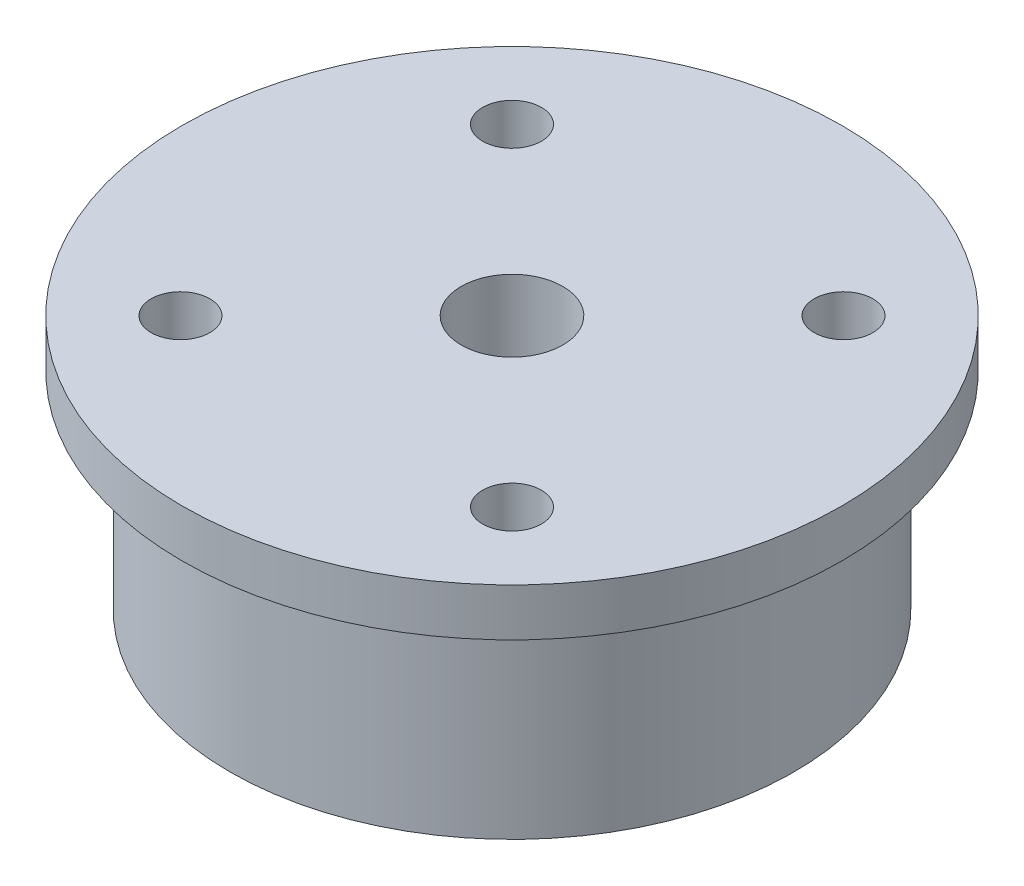
ISO-10303-21;
HEADER;
FILE_DESCRIPTION(('STEP AP214'),'2;1');
FILE_NAME('part.step','',(''),(''),'','','');
FILE_SCHEMA(('AUTOMOTIVE_DESIGN { 1 0 10303 214 1 1 1 1 }'));
ENDSEC;
DATA;
#1=APPLICATION_CONTEXT('core data for automotive mechanical design processes');
#2=APPLICATION_PROTOCOL_DEFINITION('international standard','automotive_design',2000,#1);
#3=PRODUCT_CONTEXT('',#1,'mechanical');
#4=PRODUCT('Part','Part','',(#3));
#5=PRODUCT_RELATED_PRODUCT_CATEGORY('part','',(#4));
#6=PRODUCT_DEFINITION_FORMATION('','',#4);
#7=PRODUCT_DEFINITION_CONTEXT('part definition',#1,'design');
#8=PRODUCT_DEFINITION('design','',#6,#7);
#9=PRODUCT_DEFINITION_SHAPE('','',#8);
#10=(LENGTH_UNIT() NAMED_UNIT(*) SI_UNIT(.MILLI.,.METRE.));
#11=(NAMED_UNIT(*) PLANE_ANGLE_UNIT() SI_UNIT($,.RADIAN.));
#12=(NAMED_UNIT(*) SI_UNIT($,.STERADIAN.) SOLID_ANGLE_UNIT());
#13=UNCERTAINTY_MEASURE_WITH_UNIT(LENGTH_MEASURE(1.E-05),#10,'distance_accuracy_value','');
#14=(GEOMETRIC_REPRESENTATION_CONTEXT(3) GLOBAL_UNCERTAINTY_ASSIGNED_CONTEXT((#13)) GLOBAL_UNIT_ASSIGNED_CONTEXT((#10,
#11,#12)) REPRESENTATION_CONTEXT('',''));
#15=CARTESIAN_POINT('',(0.,0.,0.));
#16=DIRECTION('',(0.,0.,1.));
#17=DIRECTION('',(1.,0.,0.));
#18=AXIS2_PLACEMENT_3D('',#15,#16,#17);
#19=CARTESIAN_POINT('',(0.,6.5,0.));
#20=DIRECTION('',(0.,-1.,0.));
#21=DIRECTION('',(0.,0.,-1.));
#22=AXIS2_PLACEMENT_3D('',#19,#20,#21);
#23=CYLINDRICAL_SURFACE('',#22,1.6);
#24=CARTESIAN_POINT('',(0.,0.,0.));
#25=DIRECTION('',(0.,1.,0.));
#26=DIRECTION('',(0.,0.,1.));
#27=AXIS2_PLACEMENT_3D('',#24,#25,#26);
#28=CIRCLE('',#27,1.6);
#29=CARTESIAN_POINT('',(0.,0.,-1.6));
#30=VERTEX_POINT('',#29);
#31=EDGE_CURVE('E79',#30,#30,#28,.T.);
#32=CARTESIAN_POINT('',(0.,8.,0.));
#33=DIRECTION('',(0.,1.,0.));
#34=DIRECTION('',(0.,0.,1.));
#35=AXIS2_PLACEMENT_3D('',#32,#33,#34);
#36=CIRCLE('',#35,1.6);
#37=CARTESIAN_POINT('',(0.,8.,-1.6));
#38=VERTEX_POINT('',#37);
#39=EDGE_CURVE('E97',#38,#38,#36,.T.);
#40=CARTESIAN_POINT('',(0.,0.,-1.6));
#41=CARTESIAN_POINT('',(0.,0.0833333333333333,-1.6));
#42=CARTESIAN_POINT('',(0.,0.166666666666667,-1.6));
#43=CARTESIAN_POINT('',(0.,0.333333333333334,-1.6));
#44=CARTESIAN_POINT('',(0.,0.416666666666667,-1.6));
#45=CARTESIAN_POINT('',(0.,0.583333333333334,-1.6));
#46=CARTESIAN_POINT('',(0.,0.666666666666667,-1.6));
#47=CARTESIAN_POINT('',(0.,0.833333333333333,-1.6));
#48=CARTESIAN_POINT('',(0.,0.916666666666667,-1.6));
#49=CARTESIAN_POINT('',(0.,1.08333333333333,-1.6));
#50=CARTESIAN_POINT('',(0.,1.16666666666667,-1.6));
#51=CARTESIAN_POINT('',(0.,1.33333333333333,-1.6));
#52=CARTESIAN_POINT('',(0.,1.41666666666667,-1.6));
#53=CARTESIAN_POINT('',(0.,1.58333333333333,-1.6));
#54=CARTESIAN_POINT('',(0.,1.66666666666667,-1.6));
#55=CARTESIAN_POINT('',(0.,1.83333333333333,-1.6));
#56=CARTESIAN_POINT('',(0.,1.91666666666667,-1.6));
#57=CARTESIAN_POINT('',(0.,2.08333333333333,-1.6));
#58=CARTESIAN_POINT('',(0.,2.16666666666667,-1.6));
#59=CARTESIAN_POINT('',(0.,2.33333333333333,-1.6));
#60=CARTESIAN_POINT('',(0.,2.41666666666667,-1.6));
#61=CARTESIAN_POINT('',(0.,2.58333333333333,-1.6));
#62=CARTESIAN_POINT('',(0.,2.66666666666667,-1.6));
#63=CARTESIAN_POINT('',(0.,2.83333333333333,-1.6));
#64=CARTESIAN_POINT('',(0.,2.91666666666667,-1.6));
#65=CARTESIAN_POINT('',(0.,3.08333333333333,-1.6));
#66=CARTESIAN_POINT('',(0.,3.16666666666667,-1.6));
#67=CARTESIAN_POINT('',(0.,3.33333333333333,-1.6));
#68=CARTESIAN_POINT('',(0.,3.41666666666667,-1.6));
#69=CARTESIAN_POINT('',(0.,3.58333333333333,-1.6));
#70=CARTESIAN_POINT('',(0.,3.66666666666667,-1.6));
#71=CARTESIAN_POINT('',(0.,3.83333333333333,-1.6));
#72=CARTESIAN_POINT('',(0.,3.91666666666667,-1.6));
#73=CARTESIAN_POINT('',(0.,4.08333333333333,-1.6));
#74=CARTESIAN_POINT('',(0.,4.16666666666667,-1.6));
#75=CARTESIAN_POINT('',(0.,4.33333333333333,-1.6));
#76=CARTESIAN_POINT('',(0.,4.41666666666667,-1.6));
#77=CARTESIAN_POINT('',(0.,4.58333333333333,-1.6));
#78=CARTESIAN_POINT('',(0.,4.66666666666667,-1.6));
#79=CARTESIAN_POINT('',(0.,4.83333333333333,-1.6));
#80=CARTESIAN_POINT('',(0.,4.91666666666667,-1.6));
#81=CARTESIAN_POINT('',(0.,5.08333333333333,-1.6));
#82=CARTESIAN_POINT('',(0.,5.16666666666667,-1.6));
#83=CARTESIAN_POINT('',(0.,5.33333333333333,-1.6));
#84=CARTESIAN_POINT('',(0.,5.41666666666667,-1.6));
#85=CARTESIAN_POINT('',(0.,5.58333333333333,-1.6));
#86=CARTESIAN_POINT('',(0.,5.66666666666667,-1.6));
#87=CARTESIAN_POINT('',(0.,5.83333333333333,-1.6));
#88=CARTESIAN_POINT('',(0.,5.91666666666667,-1.6));
#89=CARTESIAN_POINT('',(0.,6.08333333333333,-1.6));
#90=CARTESIAN_POINT('',(0.,6.16666666666667,-1.6));
#91=CARTESIAN_POINT('',(0.,6.33333333333333,-1.6));
#92=CARTESIAN_POINT('',(0.,6.41666666666667,-1.6));
#93=CARTESIAN_POINT('',(0.,6.58333333333333,-1.6));
#94=CARTESIAN_POINT('',(0.,6.66666666666667,-1.6));
#95=CARTESIAN_POINT('',(0.,6.83333333333333,-1.6));
#96=CARTESIAN_POINT('',(0.,6.91666666666667,-1.6));
#97=CARTESIAN_POINT('',(0.,7.08333333333333,-1.6));
#98=CARTESIAN_POINT('',(0.,7.16666666666667,-1.6));
#99=CARTESIAN_POINT('',(0.,7.33333333333333,-1.6));
#100=CARTESIAN_POINT('',(0.,7.41666666666667,-1.6));
#101=CARTESIAN_POINT('',(0.,7.58333333333333,-1.6));
#102=CARTESIAN_POINT('',(0.,7.66666666666667,-1.6));
#103=CARTESIAN_POINT('',(0.,7.83333333333333,-1.6));
#104=CARTESIAN_POINT('',(0.,7.91666666666667,-1.6));
#105=CARTESIAN_POINT('',(0.,8.,-1.6));
#106=B_SPLINE_CURVE_WITH_KNOTS('',3,(#40,#41,#42,#43,#44,#45,#46,#47,#48,#49,#50,#51,#52,#53,
#54,#55,#56,#57,#58,#59,#60,#61,#62,#63,#64,#65,#66,#67,#68,#69,#70,#71,#72,#73,#74,#75,#76,#77,
#78,#79,#80,#81,#82,#83,#84,#85,#86,#87,#88,#89,#90,#91,#92,#93,#94,#95,#96,#97,#98,#99,#100,
#101,#102,#103,#104,#105),.UNSPECIFIED.,.F.,.F.,(4,2,2,2,2,2,2,2,2,2,2,2,2,2,2,2,2,2,2,2,2,2,2,
2,2,2,2,2,2,2,2,2,4),(0.,0.25,0.5,0.75,1.,1.25,1.5,1.75,2.,2.25,2.5,2.75,3.,3.25,3.5,3.75,4.,
4.25,4.5,4.75,5.,5.25,5.5,5.75,6.,6.25,6.5,6.75,7.,7.25,7.5,7.75,8.),.UNSPECIFIED.);
#107=EDGE_CURVE('BSEAM55',#30,#38,#106,.T.);
#108=ORIENTED_EDGE('',*,*,#31,.F.);
#109=ORIENTED_EDGE('',*,*,#39,.T.);
#110=ORIENTED_EDGE('',*,*,#107,.T.);
#111=ORIENTED_EDGE('',*,*,#107,.F.);
#112=EDGE_LOOP('',(#108,#110,#109,#111));
#113=FACE_BOUND('',#112,.T.);
#114=ADVANCED_FACE('F55',(#113),#23,.F.);
#115=CARTESIAN_POINT('',(0.,6.5,0.));
#116=DIRECTION('',(0.,-1.,0.));
#117=DIRECTION('',(0.,0.,-1.));
#118=AXIS2_PLACEMENT_3D('',#115,#116,#117);
#119=CYLINDRICAL_SURFACE('',#118,8.88);
#120=CARTESIAN_POINT('',(0.,5.1,-8.88));
#121=CARTESIAN_POINT('',(-0.129585289133264,5.09999684998418,-8.87999801208095));
#122=CARTESIAN_POINT('',(-0.259204506457063,5.0892455305228,-8.87713549724354));
#123=CARTESIAN_POINT('',(-0.514711359988746,5.04659897144089,-8.86599427911455));
#124=CARTESIAN_POINT('',(-0.640597128899053,5.01469333170439,-8.85771291177428));
#125=CARTESIAN_POINT('',(-0.884911819698373,4.93084628380542,-8.83664840609071));
#126=CARTESIAN_POINT('',(-1.00335004998425,4.878930488789,-8.82387102449195));
#127=CARTESIAN_POINT('',(-1.22983818264274,4.75663118026291,-8.79516613197104));
#128=CARTESIAN_POINT('',(-1.33788743400293,4.68624651045341,-8.77923842382854));
#129=CARTESIAN_POINT('',(-1.54300100811903,4.52730821752643,-8.74554650459054));
#130=CARTESIAN_POINT('',(-1.63979394284996,4.43841092794475,-8.72775127827033));
#131=CARTESIAN_POINT('',(-1.81728597586606,4.24570565854619,-8.69252996065879));
#132=CARTESIAN_POINT('',(-1.89798303534429,4.14189579266774,-8.67510391637998));
#133=CARTESIAN_POINT('',(-2.04231001302697,3.92015327413902,-8.64227731863866));
#134=CARTESIAN_POINT('',(-2.10562879748089,3.80201178261496,-8.62691592695273));
#135=CARTESIAN_POINT('',(-2.21139821628251,3.55628791481431,-8.60041345934422));
#136=CARTESIAN_POINT('',(-2.25385263385972,3.42870725492472,-8.58927161839607));
#137=CARTESIAN_POINT('',(-2.31574775166628,3.17072954588639,-8.57278980730723));
#138=CARTESIAN_POINT('',(-2.33567999020068,3.04045852319523,-8.56732613568692));
#139=CARTESIAN_POINT('',(-2.35349721816228,2.77831586562723,-8.56244961024532));
#140=CARTESIAN_POINT('',(-2.35138625973293,2.64644452938359,-8.56303564432217));
#141=CARTESIAN_POINT('',(-2.32556749060522,2.38867246603751,-8.57008154002525));
#142=CARTESIAN_POINT('',(-2.30245331970669,2.26270716541838,-8.57637993687077));
#143=CARTESIAN_POINT('',(-2.23623456766338,2.01650937234912,-8.59388250417231));
#144=CARTESIAN_POINT('',(-2.19312841041219,1.89627733271587,-8.60508706141097));
#145=CARTESIAN_POINT('',(-2.087662826246,1.66340608032448,-8.63128223136183));
#146=CARTESIAN_POINT('',(-2.0250943723219,1.55086631347566,-8.6463136099601));
#147=CARTESIAN_POINT('',(-1.88262615275715,1.33767426687774,-8.67844671441819));
#148=CARTESIAN_POINT('',(-1.80272302226022,1.23702430093992,-8.69554884194853));
#149=CARTESIAN_POINT('',(-1.62481333242203,1.0470759466642,-8.73056953206238));
#150=CARTESIAN_POINT('',(-1.52630795703414,0.958245694470325,-8.74849667937925));
#151=CARTESIAN_POINT('',(-1.31558009861242,0.798270329447083,-8.78265480249399));
#152=CARTESIAN_POINT('',(-1.20335709130346,0.727125892868593,-8.79888571341927));
#153=CARTESIAN_POINT('',(-0.967661735310538,0.604339889327529,-8.82791993444626));
#154=CARTESIAN_POINT('',(-0.844143880864923,0.552781953993764,-8.84070847993485));
#155=CARTESIAN_POINT('',(-0.589778271558278,0.471297217316951,-8.86131025450366));
#156=CARTESIAN_POINT('',(-0.458932099885075,0.441365763127861,-8.86912455372885));
#157=CARTESIAN_POINT('',(-0.197620172874529,0.404716156971727,-8.87873597197536));
#158=CARTESIAN_POINT('',(-0.0672496350220839,0.397361408014559,-8.88069805981672));
#159=CARTESIAN_POINT('',(0.192861735434264,0.404317444923737,-8.87885772294866));
#160=CARTESIAN_POINT('',(0.322602630719435,0.418626027888854,-8.87505588436142));
#161=CARTESIAN_POINT('',(0.575507223925612,0.467980069404079,-8.86222132477574));
#162=CARTESIAN_POINT('',(0.698744975887391,0.502671426070991,-8.85327798091623));
#163=CARTESIAN_POINT('',(0.937640440787909,0.591395895235778,-8.83117402567267));
#164=CARTESIAN_POINT('',(1.05329733718154,0.645431087249516,-8.81801296088789));
#165=CARTESIAN_POINT('',(1.27622899839518,0.77249674827515,-8.78854582236923));
#166=CARTESIAN_POINT('',(1.38329806007462,0.845874812506769,-8.77218377863204));
#167=CARTESIAN_POINT('',(1.58382693086847,1.00910539460631,-8.73820654532676));
#168=CARTESIAN_POINT('',(1.67728408771308,1.098961115449,-8.72059111252941));
#169=CARTESIAN_POINT('',(1.85061144919231,1.29556537626198,-8.68548712936175));
#170=CARTESIAN_POINT('',(1.93003280916631,1.40271339525644,-8.66801565548488));
#171=CARTESIAN_POINT('',(2.06977621906292,1.62918455296581,-8.6357159577957));
#172=CARTESIAN_POINT('',(2.13009907490246,1.74850717765679,-8.62088762246002));
#173=CARTESIAN_POINT('',(2.22947901569099,1.99533806093285,-8.59572292540364));
#174=CARTESIAN_POINT('',(2.2686598069129,2.12279371282514,-8.58536050620928));
#175=CARTESIAN_POINT('',(2.32494065000371,2.38280453385698,-8.57029263886158));
#176=CARTESIAN_POINT('',(2.34204624073471,2.51535841520672,-8.5655857717009));
#177=CARTESIAN_POINT('',(2.35337608831695,2.77721126080348,-8.56247919441447));
#178=CARTESIAN_POINT('',(2.34832123773893,2.90647714675708,-8.56388076428023));
#179=CARTESIAN_POINT('',(2.31714312273957,3.16224273259772,-8.57236860268427));
#180=CARTESIAN_POINT('',(2.29102038498937,3.28874250155307,-8.57945472911565));
#181=CARTESIAN_POINT('',(2.21886302525025,3.53449310420915,-8.59839589150808));
#182=CARTESIAN_POINT('',(2.17297897142437,3.65379112593871,-8.61021481976972));
#183=CARTESIAN_POINT('',(2.06271861187933,3.88308540068774,-8.63729126062263));
#184=CARTESIAN_POINT('',(1.99833944588416,3.99308021155381,-8.65254930499581));
#185=CARTESIAN_POINT('',(1.85072215282304,4.20409207453658,-8.68533777980724));
#186=CARTESIAN_POINT('',(1.76699104793136,4.3047560519055,-8.70292129676406));
#187=CARTESIAN_POINT('',(1.58398714605769,4.49083875709403,-8.73808054188653));
#188=CARTESIAN_POINT('',(1.48471058752775,4.57625378437753,-8.75565626713191));
#189=CARTESIAN_POINT('',(1.27092154046083,4.7311730378896,-8.78926026106073));
#190=CARTESIAN_POINT('',(1.15613319533889,4.80030602756172,-8.80524834769998));
#191=CARTESIAN_POINT('',(0.916145366917736,4.91818441187165,-8.83343815754617));
#192=CARTESIAN_POINT('',(0.790952726409114,4.96694308123272,-8.84564234478037));
#193=CARTESIAN_POINT('',(0.555161542007729,5.03621877973961,-8.86328267560475));
#194=CARTESIAN_POINT('',(0.44559320066805,5.06008167310706,-8.8695063191191));
#195=CARTESIAN_POINT('',(0.224024869252993,5.09197288815313,-8.87786564523955));
#196=CARTESIAN_POINT('',(0.112025112606921,5.10000272315537,-8.88000171853501));
#197=CARTESIAN_POINT('',(0.,5.1,-8.88));
#198=B_SPLINE_CURVE_WITH_KNOTS('',3,(#120,#121,#122,#123,#124,#125,#126,#127,#128,#129,#130,
#131,#132,#133,#134,#135,#136,#137,#138,#139,#140,#141,#142,#143,#144,#145,#146,#147,#148,#149,
#150,#151,#152,#153,#154,#155,#156,#157,#158,#159,#160,#161,#162,#163,#164,#165,#166,#167,#168,
#169,#170,#171,#172,#173,#174,#175,#176,#177,#178,#179,#180,#181,#182,#183,#184,#185,#186,#187,
#188,#189,#190,#191,#192,#193,#194,#195,#196,#197),.UNSPECIFIED.,.T.,.F.,(4,2,2,2,2,2,2,2,2,2,2,
2,2,2,2,2,2,2,2,2,2,2,2,2,2,2,2,2,2,2,2,2,2,2,2,2,2,2,4),(0.,0.388345079422037,
0.776881222965017,1.16492168018898,1.55298643765955,1.94902638559029,2.34511646667209,
2.74789348968465,3.1505974522173,3.54433170640418,3.93799358272355,4.32086366224912,
4.70376393120064,5.0909275122296,5.47816631342726,5.87783634471825,6.27752165580504,
6.67889488249067,7.08018172968843,7.47004440781371,7.85986744423962,8.24311051736039,
8.62639480255105,9.01710172924578,9.40788468334782,9.80950851062321,10.2111153879539,
10.6103461789214,11.0094767798816,11.3957214818909,11.7819565285594,12.1652993850264,
12.548701557553,12.9432277378033,13.3378495298622,13.7407470789338,14.1433817125166,
14.479134021233,14.8148542371895),.UNSPECIFIED.);
#199=CARTESIAN_POINT('',(0.,5.1,-8.88));
#200=VERTEX_POINT('',#199);
#201=EDGE_CURVE('E11',#200,#200,#198,.T.);
#202=ORIENTED_EDGE('',*,*,#201,.T.);
#203=EDGE_LOOP('',(#202));
#204=FACE_BOUND('',#203,.T.);
#205=CARTESIAN_POINT('',(0.,6.5,0.));
#206=DIRECTION('',(0.,1.,0.));
#207=DIRECTION('',(0.,0.,1.));
#208=AXIS2_PLACEMENT_3D('',#205,#206,#207);
#209=CIRCLE('',#208,8.88);
#210=CARTESIAN_POINT('',(0.,6.5,8.88));
#211=VERTEX_POINT('',#210);
#212=EDGE_CURVE('E66',#211,#211,#209,.T.);
#213=ORIENTED_EDGE('',*,*,#212,.F.);
#214=EDGE_LOOP('',(#213));
#215=FACE_BOUND('',#214,.T.);
#216=CARTESIAN_POINT('',(0.,0.,0.));
#217=DIRECTION('',(0.,1.,0.));
#218=DIRECTION('',(0.,0.,1.));
#219=AXIS2_PLACEMENT_3D('',#216,#217,#218);
#220=CIRCLE('',#219,8.88);
#221=CARTESIAN_POINT('',(0.,0.,8.88));
#222=VERTEX_POINT('',#221);
#223=EDGE_CURVE('E72',#222,#222,#220,.T.);
#224=ORIENTED_EDGE('',*,*,#223,.T.);
#225=EDGE_LOOP('',(#224));
#226=FACE_BOUND('',#225,.T.);
#227=ADVANCED_FACE('F162',(#204,#215,#226),#119,.T.);
#228=CARTESIAN_POINT('',(0.,0.,0.));
#229=DIRECTION('',(0.,1.,0.));
#230=DIRECTION('',(0.,0.,1.));
#231=AXIS2_PLACEMENT_3D('',#228,#229,#230);
#232=PLANE('',#231);
#233=ORIENTED_EDGE('',*,*,#31,.T.);
#234=EDGE_LOOP('',(#233));
#235=FACE_BOUND('',#234,.T.);
#236=ORIENTED_EDGE('',*,*,#223,.F.);
#237=EDGE_LOOP('',(#236));
#238=FACE_BOUND('',#237,.T.);
#239=ADVANCED_FACE('F154',(#235,#238),#232,.F.);
#240=CARTESIAN_POINT('',(0.,8.,0.));
#241=DIRECTION('',(0.,1.,0.));
#242=DIRECTION('',(0.,0.,1.));
#243=AXIS2_PLACEMENT_3D('',#240,#241,#242);
#244=PLANE('',#243);
#245=CARTESIAN_POINT('',(5.21844804515673,8.,-5.21844804515671));
#246=DIRECTION('',(0.,1.,0.));
#247=DIRECTION('',(0.,0.,1.));
#248=AXIS2_PLACEMENT_3D('',#245,#246,#247);
#249=CIRCLE('',#248,0.925000000000001);
#250=CARTESIAN_POINT('',(5.21844804515673,8.,-4.29344804515671));
#251=VERTEX_POINT('',#250);
#252=EDGE_CURVE('E127',#251,#251,#249,.T.);
#253=ORIENTED_EDGE('',*,*,#252,.F.);
#254=EDGE_LOOP('',(#253));
#255=FACE_BOUND('',#254,.T.);
#256=CARTESIAN_POINT('',(5.21844804515669,8.,5.21844804515675));
#257=DIRECTION('',(0.,1.,0.));
#258=DIRECTION('',(0.,0.,1.));
#259=AXIS2_PLACEMENT_3D('',#256,#257,#258);
#260=CIRCLE('',#259,0.925000000000001);
#261=CARTESIAN_POINT('',(5.21844804515669,8.,6.14344804515675));
#262=VERTEX_POINT('',#261);
#263=EDGE_CURVE('E135',#262,#262,#260,.T.);
#264=ORIENTED_EDGE('',*,*,#263,.F.);
#265=EDGE_LOOP('',(#264));
#266=FACE_BOUND('',#265,.T.);
#267=CARTESIAN_POINT('',(-5.21844804515676,8.,5.21844804515668));
#268=DIRECTION('',(0.,1.,0.));
#269=DIRECTION('',(0.,0.,1.));
#270=AXIS2_PLACEMENT_3D('',#267,#268,#269);
#271=CIRCLE('',#270,0.925);
#272=CARTESIAN_POINT('',(-5.21844804515676,8.,6.14344804515668));
#273=VERTEX_POINT('',#272);
#274=EDGE_CURVE('E119',#273,#273,#271,.T.);
#275=ORIENTED_EDGE('',*,*,#274,.F.);
#276=EDGE_LOOP('',(#275));
#277=FACE_BOUND('',#276,.T.);
#278=CARTESIAN_POINT('',(-5.21844804515673,8.,-5.21844804515671));
#279=DIRECTION('',(0.,1.,0.));
#280=DIRECTION('',(0.,0.,1.));
#281=AXIS2_PLACEMENT_3D('',#278,#279,#280);
#282=CIRCLE('',#281,0.925);
#283=CARTESIAN_POINT('',(-5.21844804515673,8.,-4.29344804515671));
#284=VERTEX_POINT('',#283);
#285=EDGE_CURVE('E115',#284,#284,#282,.T.);
#286=ORIENTED_EDGE('',*,*,#285,.F.);
#287=EDGE_LOOP('',(#286));
#288=FACE_BOUND('',#287,.T.);
#289=CARTESIAN_POINT('',(0.,8.,0.));
#290=DIRECTION('',(0.,1.,0.));
#291=DIRECTION('',(0.,0.,1.));
#292=AXIS2_PLACEMENT_3D('',#289,#290,#291);
#293=CIRCLE('',#292,10.38);
#294=CARTESIAN_POINT('',(0.,8.,10.38));
#295=VERTEX_POINT('',#294);
#296=EDGE_CURVE('E86',#295,#295,#293,.T.);
#297=ORIENTED_EDGE('',*,*,#296,.T.);
#298=EDGE_LOOP('',(#297));
#299=FACE_BOUND('',#298,.T.);
#300=ORIENTED_EDGE('',*,*,#39,.F.);
#301=EDGE_LOOP('',(#300));
#302=FACE_BOUND('',#301,.T.);
#303=ADVANCED_FACE('F150',(#255,#266,#277,#288,#299,#302),#244,.T.);
#304=CARTESIAN_POINT('',(0.,6.5,0.));
#305=DIRECTION('',(0.,1.,0.));
#306=DIRECTION('',(0.,0.,1.));
#307=AXIS2_PLACEMENT_3D('',#304,#305,#306);
#308=PLANE('',#307);
#309=ORIENTED_EDGE('',*,*,#212,.T.);
#310=EDGE_LOOP('',(#309));
#311=FACE_BOUND('',#310,.T.);
#312=CARTESIAN_POINT('',(0.,6.5,0.));
#313=DIRECTION('',(0.,1.,0.));
#314=DIRECTION('',(0.,0.,1.));
#315=AXIS2_PLACEMENT_3D('',#312,#313,#314);
#316=CIRCLE('',#315,10.38);
#317=CARTESIAN_POINT('',(0.,6.5,10.38));
#318=VERTEX_POINT('',#317);
#319=EDGE_CURVE('E82',#318,#318,#316,.T.);
#320=ORIENTED_EDGE('',*,*,#319,.F.);
#321=EDGE_LOOP('',(#320));
#322=FACE_BOUND('',#321,.T.);
#323=ADVANCED_FACE('F153',(#311,#322),#308,.F.);
#324=CARTESIAN_POINT('',(0.,8.,0.));
#325=DIRECTION('',(0.,-1.,0.));
#326=DIRECTION('',(0.,0.,-1.));
#327=AXIS2_PLACEMENT_3D('',#324,#325,#326);
#328=CYLINDRICAL_SURFACE('',#327,10.38);
#329=ORIENTED_EDGE('',*,*,#296,.F.);
#330=EDGE_LOOP('',(#329));
#331=FACE_BOUND('',#330,.T.);
#332=ORIENTED_EDGE('',*,*,#319,.T.);
#333=EDGE_LOOP('',(#332));
#334=FACE_BOUND('',#333,.T.);
#335=ADVANCED_FACE('F172',(#331,#334),#328,.T.);
#336=CARTESIAN_POINT('',(0.,2.75,-7.68));
#337=DIRECTION('',(0.,0.,-1.));
#338=DIRECTION('',(-1.,0.,0.));
#339=AXIS2_PLACEMENT_3D('',#336,#337,#338);
#340=CYLINDRICAL_SURFACE('',#339,2.35);
#341=CARTESIAN_POINT('',(0.,2.75,-7.68));
#342=DIRECTION('',(0.,0.,-1.));
#343=DIRECTION('',(-1.,0.,0.));
#344=AXIS2_PLACEMENT_3D('',#341,#342,#343);
#345=CIRCLE('',#344,2.35);
#346=CARTESIAN_POINT('',(-2.35,2.75,-7.68));
#347=VERTEX_POINT('',#346);
#348=EDGE_CURVE('E102',#347,#347,#345,.T.);
#349=ORIENTED_EDGE('',*,*,#348,.F.);
#350=EDGE_LOOP('',(#349));
#351=FACE_BOUND('',#350,.T.);
#352=ORIENTED_EDGE('',*,*,#201,.F.);
#353=EDGE_LOOP('',(#352));
#354=FACE_BOUND('',#353,.T.);
#355=ADVANCED_FACE('F175',(#351,#354),#340,.F.);
#356=CARTESIAN_POINT('',(0.,2.75,-7.68));
#357=DIRECTION('',(0.,0.,-1.));
#358=DIRECTION('',(-1.,0.,0.));
#359=AXIS2_PLACEMENT_3D('',#356,#357,#358);
#360=PLANE('',#359);
#361=CARTESIAN_POINT('',(0.,2.75,-7.68));
#362=DIRECTION('',(0.,0.,-1.));
#363=DIRECTION('',(-1.,0.,0.));
#364=AXIS2_PLACEMENT_3D('',#361,#362,#363);
#365=CIRCLE('',#364,2.1);
#366=CARTESIAN_POINT('',(-2.1,2.75,-7.68));
#367=VERTEX_POINT('',#366);
#368=EDGE_CURVE('E106',#367,#367,#365,.T.);
#369=ORIENTED_EDGE('',*,*,#368,.F.);
#370=EDGE_LOOP('',(#369));
#371=FACE_BOUND('',#370,.T.);
#372=ORIENTED_EDGE('',*,*,#348,.T.);
#373=EDGE_LOOP('',(#372));
#374=FACE_BOUND('',#373,.T.);
#375=ADVANCED_FACE('F181',(#371,#374),#360,.T.);
#376=CARTESIAN_POINT('',(0.,2.75,-3.88));
#377=DIRECTION('',(0.,0.,-1.));
#378=DIRECTION('',(-1.,0.,0.));
#379=AXIS2_PLACEMENT_3D('',#376,#377,#378);
#380=CYLINDRICAL_SURFACE('',#379,2.1);
#381=ORIENTED_EDGE('',*,*,#368,.T.);
#382=EDGE_LOOP('',(#381));
#383=FACE_BOUND('',#382,.T.);
#384=CARTESIAN_POINT('',(0.,2.75,-3.88));
#385=DIRECTION('',(0.,0.,-1.));
#386=DIRECTION('',(-1.,0.,0.));
#387=AXIS2_PLACEMENT_3D('',#384,#385,#386);
#388=CIRCLE('',#387,2.1);
#389=CARTESIAN_POINT('',(-2.1,2.75,-3.88));
#390=VERTEX_POINT('',#389);
#391=EDGE_CURVE('E110',#390,#390,#388,.T.);
#392=ORIENTED_EDGE('',*,*,#391,.F.);
#393=EDGE_LOOP('',(#392));
#394=FACE_BOUND('',#393,.T.);
#395=ADVANCED_FACE('F185',(#383,#394),#380,.F.);
#396=CARTESIAN_POINT('',(0.,0.,-3.88));
#397=DIRECTION('',(0.,0.,-1.));
#398=DIRECTION('',(-1.,0.,0.));
#399=AXIS2_PLACEMENT_3D('',#396,#397,#398);
#400=PLANE('',#399);
#401=ORIENTED_EDGE('',*,*,#391,.T.);
#402=EDGE_LOOP('',(#401));
#403=FACE_BOUND('',#402,.T.);
#404=ADVANCED_FACE('F189',(#403),#400,.T.);
#405=CARTESIAN_POINT('',(-5.21844804515673,5.,-5.21844804515671));
#406=DIRECTION('',(0.,1.,0.));
#407=DIRECTION('',(0.,0.,1.));
#408=AXIS2_PLACEMENT_3D('',#405,#406,#407);
#409=CYLINDRICAL_SURFACE('',#408,0.925);
#410=CARTESIAN_POINT('',(-5.21844804515673,5.,-5.21844804515671));
#411=DIRECTION('',(0.,1.,0.));
#412=DIRECTION('',(0.,0.,1.));
#413=AXIS2_PLACEMENT_3D('',#410,#411,#412);
#414=CIRCLE('',#413,0.925);
#415=CARTESIAN_POINT('',(-5.21844804515673,5.,-4.29344804515671));
#416=VERTEX_POINT('',#415);
#417=EDGE_CURVE('E114',#416,#416,#414,.T.);
#418=ORIENTED_EDGE('',*,*,#417,.F.);
#419=EDGE_LOOP('',(#418));
#420=FACE_BOUND('',#419,.T.);
#421=ORIENTED_EDGE('',*,*,#285,.T.);
#422=EDGE_LOOP('',(#421));
#423=FACE_BOUND('',#422,.T.);
#424=ADVANCED_FACE('F193',(#420,#423),#409,.F.);
#425=CARTESIAN_POINT('',(-5.21844804515673,5.,-5.21844804515671));
#426=DIRECTION('',(0.,1.,0.));
#427=DIRECTION('',(0.,0.,1.));
#428=AXIS2_PLACEMENT_3D('',#425,#426,#427);
#429=PLANE('',#428);
#430=ORIENTED_EDGE('',*,*,#417,.T.);
#431=EDGE_LOOP('',(#430));
#432=FACE_BOUND('',#431,.T.);
#433=ADVANCED_FACE('F197',(#432),#429,.T.);
#434=CARTESIAN_POINT('',(-5.21844804515676,5.,5.21844804515668));
#435=DIRECTION('',(0.,1.,0.));
#436=DIRECTION('',(0.,0.,1.));
#437=AXIS2_PLACEMENT_3D('',#434,#435,#436);
#438=CYLINDRICAL_SURFACE('',#437,0.925);
#439=CARTESIAN_POINT('',(-5.21844804515676,5.,5.21844804515668));
#440=DIRECTION('',(0.,1.,0.));
#441=DIRECTION('',(0.,0.,1.));
#442=AXIS2_PLACEMENT_3D('',#439,#440,#441);
#443=CIRCLE('',#442,0.925);
#444=CARTESIAN_POINT('',(-5.21844804515676,5.,6.14344804515668));
#445=VERTEX_POINT('',#444);
#446=EDGE_CURVE('E139',#445,#445,#443,.T.);
#447=ORIENTED_EDGE('',*,*,#446,.F.);
#448=EDGE_LOOP('',(#447));
#449=FACE_BOUND('',#448,.T.);
#450=ORIENTED_EDGE('',*,*,#274,.T.);
#451=EDGE_LOOP('',(#450));
#452=FACE_BOUND('',#451,.T.);
#453=ADVANCED_FACE('F148',(#449,#452),#438,.F.);
#454=CARTESIAN_POINT('',(-5.21844804515676,5.,5.21844804515668));
#455=DIRECTION('',(0.,1.,0.));
#456=DIRECTION('',(0.,0.,1.));
#457=AXIS2_PLACEMENT_3D('',#454,#455,#456);
#458=PLANE('',#457);
#459=ORIENTED_EDGE('',*,*,#446,.T.);
#460=EDGE_LOOP('',(#459));
#461=FACE_BOUND('',#460,.T.);
#462=ADVANCED_FACE('F217',(#461),#458,.T.);
#463=CARTESIAN_POINT('',(5.21844804515669,5.,5.21844804515675));
#464=DIRECTION('',(0.,1.,0.));
#465=DIRECTION('',(0.,0.,1.));
#466=AXIS2_PLACEMENT_3D('',#463,#464,#465);
#467=CYLINDRICAL_SURFACE('',#466,0.925000000000001);
#468=CARTESIAN_POINT('',(5.21844804515669,5.,5.21844804515675));
#469=DIRECTION('',(0.,1.,0.));
#470=DIRECTION('',(0.,0.,1.));
#471=AXIS2_PLACEMENT_3D('',#468,#469,#470);
#472=CIRCLE('',#471,0.925000000000001);
#473=CARTESIAN_POINT('',(5.21844804515669,5.,6.14344804515675));
#474=VERTEX_POINT('',#473);
#475=EDGE_CURVE('E131',#474,#474,#472,.T.);
#476=ORIENTED_EDGE('',*,*,#475,.F.);
#477=EDGE_LOOP('',(#476));
#478=FACE_BOUND('',#477,.T.);
#479=ORIENTED_EDGE('',*,*,#263,.T.);
#480=EDGE_LOOP('',(#479));
#481=FACE_BOUND('',#480,.T.);
#482=ADVANCED_FACE('F213',(#478,#481),#467,.F.);
#483=CARTESIAN_POINT('',(5.21844804515669,5.,5.21844804515675));
#484=DIRECTION('',(0.,1.,0.));
#485=DIRECTION('',(0.,0.,1.));
#486=AXIS2_PLACEMENT_3D('',#483,#484,#485);
#487=PLANE('',#486);
#488=ORIENTED_EDGE('',*,*,#475,.T.);
#489=EDGE_LOOP('',(#488));
#490=FACE_BOUND('',#489,.T.);
#491=ADVANCED_FACE('F209',(#490),#487,.T.);
#492=CARTESIAN_POINT('',(5.21844804515673,5.,-5.21844804515671));
#493=DIRECTION('',(0.,1.,0.));
#494=DIRECTION('',(0.,0.,1.));
#495=AXIS2_PLACEMENT_3D('',#492,#493,#494);
#496=CYLINDRICAL_SURFACE('',#495,0.925000000000001);
#497=CARTESIAN_POINT('',(5.21844804515673,5.,-5.21844804515671));
#498=DIRECTION('',(0.,1.,0.));
#499=DIRECTION('',(0.,0.,1.));
#500=AXIS2_PLACEMENT_3D('',#497,#498,#499);
#501=CIRCLE('',#500,0.925000000000001);
#502=CARTESIAN_POINT('',(5.21844804515673,5.,-4.29344804515671));
#503=VERTEX_POINT('',#502);
#504=EDGE_CURVE('E123',#503,#503,#501,.T.);
#505=ORIENTED_EDGE('',*,*,#504,.F.);
#506=EDGE_LOOP('',(#505));
#507=FACE_BOUND('',#506,.T.);
#508=ORIENTED_EDGE('',*,*,#252,.T.);
#509=EDGE_LOOP('',(#508));
#510=FACE_BOUND('',#509,.T.);
#511=ADVANCED_FACE('F205',(#507,#510),#496,.F.);
#512=CARTESIAN_POINT('',(5.21844804515673,5.,-5.21844804515671));
#513=DIRECTION('',(0.,1.,0.));
#514=DIRECTION('',(0.,0.,1.));
#515=AXIS2_PLACEMENT_3D('',#512,#513,#514);
#516=PLANE('',#515);
#517=ORIENTED_EDGE('',*,*,#504,.T.);
#518=EDGE_LOOP('',(#517));
#519=FACE_BOUND('',#518,.T.);
#520=ADVANCED_FACE('F202',(#519),#516,.T.);
#521=CLOSED_SHELL('',(#114,#227,#239,#303,#323,#335,#355,#375,#395,#404,#424,#433,#453,#462,
#482,#491,#511,#520));
#522=MANIFOLD_SOLID_BREP('B2',#521);
#523=ADVANCED_BREP_SHAPE_REPRESENTATION('',(#18,#522),#14);
#524=SHAPE_DEFINITION_REPRESENTATION(#9,#523);
ENDSEC;
END-ISO-10303-21;
